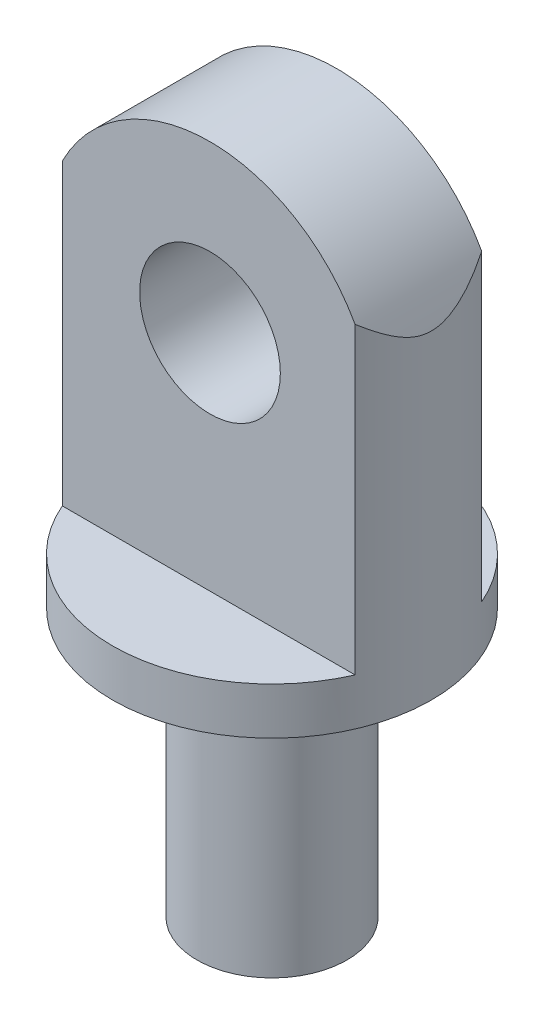
ISO-10303-21;
HEADER;
FILE_DESCRIPTION(('STEP AP214'),'2;1');
FILE_NAME('part.step','',(''),(''),'','','');
FILE_SCHEMA(('AUTOMOTIVE_DESIGN { 1 0 10303 214 1 1 1 1 }'));
ENDSEC;
DATA;
#1=APPLICATION_CONTEXT('core data for automotive mechanical design processes');
#2=APPLICATION_PROTOCOL_DEFINITION('international standard','automotive_design',2000,#1);
#3=PRODUCT_CONTEXT('',#1,'mechanical');
#4=PRODUCT('Part','Part','',(#3));
#5=PRODUCT_RELATED_PRODUCT_CATEGORY('part','',(#4));
#6=PRODUCT_DEFINITION_FORMATION('','',#4);
#7=PRODUCT_DEFINITION_CONTEXT('part definition',#1,'design');
#8=PRODUCT_DEFINITION('design','',#6,#7);
#9=PRODUCT_DEFINITION_SHAPE('','',#8);
#10=(LENGTH_UNIT() NAMED_UNIT(*) SI_UNIT(.MILLI.,.METRE.));
#11=(NAMED_UNIT(*) PLANE_ANGLE_UNIT() SI_UNIT($,.RADIAN.));
#12=(NAMED_UNIT(*) SI_UNIT($,.STERADIAN.) SOLID_ANGLE_UNIT());
#13=UNCERTAINTY_MEASURE_WITH_UNIT(LENGTH_MEASURE(1.E-05),#10,'distance_accuracy_value','');
#14=(GEOMETRIC_REPRESENTATION_CONTEXT(3) GLOBAL_UNCERTAINTY_ASSIGNED_CONTEXT((#13)) GLOBAL_UNIT_ASSIGNED_CONTEXT((#10,
#11,#12)) REPRESENTATION_CONTEXT('',''));
#15=CARTESIAN_POINT('',(0.,0.,0.));
#16=DIRECTION('',(0.,0.,1.));
#17=DIRECTION('',(1.,0.,0.));
#18=AXIS2_PLACEMENT_3D('',#15,#16,#17);
#19=CARTESIAN_POINT('',(-3.12049675532599,9.3,-1.35));
#20=DIRECTION('',(0.,0.,1.));
#21=DIRECTION('',(1.,0.,0.));
#22=AXIS2_PLACEMENT_3D('',#19,#20,#21);
#23=PLANE('',#22);
#24=CARTESIAN_POINT('',(0.0279390337068128,5.77003722118369,-1.35));
#25=DIRECTION('',(0.,0.,1.));
#26=DIRECTION('',(1.,0.,0.));
#27=AXIS2_PLACEMENT_3D('',#24,#25,#26);
#28=CIRCLE('',#27,1.5);
#29=CARTESIAN_POINT('',(1.52793903370681,5.77003722118369,-1.35));
#30=VERTEX_POINT('',#29);
#31=EDGE_CURVE('E104',#30,#30,#28,.T.);
#32=ORIENTED_EDGE('',*,*,#31,.T.);
#33=EDGE_LOOP('',(#32));
#34=FACE_BOUND('',#33,.T.);
#35=DIRECTION('',(0.,-1.,0.));
#36=VECTOR('',#35,1.);
#37=CARTESIAN_POINT('',(-3.12049675532599,9.3,-1.35));
#38=LINE('',#37,#36);
#39=CARTESIAN_POINT('',(-3.12049675532598,7.36627946538286,-1.35));
#40=VERTEX_POINT('',#39);
#41=CARTESIAN_POINT('',(-3.12049675532599,1.,-1.35));
#42=VERTEX_POINT('',#41);
#43=EDGE_CURVE('E112',#40,#42,#38,.T.);
#44=ORIENTED_EDGE('',*,*,#43,.F.);
#45=CARTESIAN_POINT('',(0.0279390337068128,5.77003722118369,-1.35));
#46=DIRECTION('',(0.,0.,1.));
#47=DIRECTION('',(1.,0.,0.));
#48=AXIS2_PLACEMENT_3D('',#45,#46,#47);
#49=CIRCLE('',#48,3.52996277881631);
#50=CARTESIAN_POINT('',(3.12049675532598,7.4720137070031,-1.35));
#51=VERTEX_POINT('',#50);
#52=EDGE_CURVE('E99',#40,#51,#49,.F.);
#53=ORIENTED_EDGE('',*,*,#52,.T.);
#54=DIRECTION('',(0.,-1.,0.));
#55=VECTOR('',#54,1.);
#56=CARTESIAN_POINT('',(3.12049675532599,9.3,-1.35));
#57=LINE('',#56,#55);
#58=CARTESIAN_POINT('',(3.12049675532599,1.,-1.35));
#59=VERTEX_POINT('',#58);
#60=EDGE_CURVE('E95',#51,#59,#57,.T.);
#61=ORIENTED_EDGE('',*,*,#60,.T.);
#62=DIRECTION('',(-1.,0.,0.));
#63=VECTOR('',#62,1.);
#64=CARTESIAN_POINT('',(-3.12049675532599,1.,-1.35));
#65=LINE('',#64,#63);
#66=EDGE_CURVE('E114',#59,#42,#65,.T.);
#67=ORIENTED_EDGE('',*,*,#66,.T.);
#68=EDGE_LOOP('',(#44,#53,#61,#67));
#69=FACE_BOUND('',#68,.T.);
#70=ADVANCED_FACE('F43',(#34,#69),#23,.F.);
#71=CARTESIAN_POINT('',(-3.12049675532599,9.3,1.35));
#72=DIRECTION('',(0.,0.,-1.));
#73=DIRECTION('',(-1.,0.,0.));
#74=AXIS2_PLACEMENT_3D('',#71,#72,#73);
#75=PLANE('',#74);
#76=CARTESIAN_POINT('',(0.0279390337068128,5.77003722118369,1.35));
#77=DIRECTION('',(0.,0.,1.));
#78=DIRECTION('',(1.,0.,0.));
#79=AXIS2_PLACEMENT_3D('',#76,#77,#78);
#80=CIRCLE('',#79,1.5);
#81=CARTESIAN_POINT('',(1.52793903370681,5.77003722118369,1.35));
#82=VERTEX_POINT('',#81);
#83=EDGE_CURVE('E170',#82,#82,#80,.T.);
#84=ORIENTED_EDGE('',*,*,#83,.F.);
#85=EDGE_LOOP('',(#84));
#86=FACE_BOUND('',#85,.T.);
#87=DIRECTION('',(0.,-1.,0.));
#88=VECTOR('',#87,1.);
#89=CARTESIAN_POINT('',(3.12049675532599,9.3,1.35));
#90=LINE('',#89,#88);
#91=CARTESIAN_POINT('',(3.12049675532598,7.4720137070031,1.35));
#92=VERTEX_POINT('',#91);
#93=CARTESIAN_POINT('',(3.12049675532599,1.,1.35));
#94=VERTEX_POINT('',#93);
#95=EDGE_CURVE('E92',#92,#94,#90,.T.);
#96=ORIENTED_EDGE('',*,*,#95,.F.);
#97=CARTESIAN_POINT('',(0.0279390337068128,5.77003722118369,1.35));
#98=DIRECTION('',(0.,0.,-1.));
#99=DIRECTION('',(-1.,0.,0.));
#100=AXIS2_PLACEMENT_3D('',#97,#98,#99);
#101=CIRCLE('',#100,3.52996277881631);
#102=CARTESIAN_POINT('',(-3.12049675532598,7.36627946538286,1.35));
#103=VERTEX_POINT('',#102);
#104=EDGE_CURVE('E62',#103,#92,#101,.T.);
#105=ORIENTED_EDGE('',*,*,#104,.F.);
#106=DIRECTION('',(0.,-1.,0.));
#107=VECTOR('',#106,1.);
#108=CARTESIAN_POINT('',(-3.12049675532599,9.3,1.35));
#109=LINE('',#108,#107);
#110=CARTESIAN_POINT('',(-3.12049675532599,1.,1.35));
#111=VERTEX_POINT('',#110);
#112=EDGE_CURVE('E67',#103,#111,#109,.T.);
#113=ORIENTED_EDGE('',*,*,#112,.T.);
#114=DIRECTION('',(1.,0.,0.));
#115=VECTOR('',#114,1.);
#116=CARTESIAN_POINT('',(-3.12049675532599,1.,1.35));
#117=LINE('',#116,#115);
#118=EDGE_CURVE('E107',#111,#94,#117,.T.);
#119=ORIENTED_EDGE('',*,*,#118,.T.);
#120=EDGE_LOOP('',(#96,#105,#113,#119));
#121=FACE_BOUND('',#120,.T.);
#122=ADVANCED_FACE('F106',(#86,#121),#75,.F.);
#123=CARTESIAN_POINT('',(0.,1.,0.));
#124=DIRECTION('',(0.,1.,0.));
#125=DIRECTION('',(0.,0.,1.));
#126=AXIS2_PLACEMENT_3D('',#123,#124,#125);
#127=PLANE('',#126);
#128=ORIENTED_EDGE('',*,*,#118,.F.);
#129=CARTESIAN_POINT('',(0.,1.,0.));
#130=DIRECTION('',(0.,1.,0.));
#131=DIRECTION('',(0.,0.,1.));
#132=AXIS2_PLACEMENT_3D('',#129,#130,#131);
#133=CIRCLE('',#132,3.4);
#134=EDGE_CURVE('E121',#111,#94,#133,.T.);
#135=ORIENTED_EDGE('',*,*,#134,.T.);
#136=EDGE_LOOP('',(#128,#135));
#137=FACE_BOUND('',#136,.T.);
#138=ADVANCED_FACE('F142',(#137),#127,.T.);
#139=CARTESIAN_POINT('',(0.,1.,0.));
#140=DIRECTION('',(0.,-1.,0.));
#141=DIRECTION('',(0.,0.,-1.));
#142=AXIS2_PLACEMENT_3D('',#139,#140,#141);
#143=CYLINDRICAL_SURFACE('',#142,3.4);
#144=ORIENTED_EDGE('',*,*,#112,.F.);
#145=CARTESIAN_POINT('',(-3.12049675532599,7.36627946538285,1.35));
#146=CARTESIAN_POINT('',(-3.13835972204669,7.33104740126524,1.30870279672957));
#147=CARTESIAN_POINT('',(-3.15543171618552,7.29590432031871,1.26700115462139));
#148=CARTESIAN_POINT('',(-3.18801107878575,7.22598859156736,1.18263831076883));
#149=CARTESIAN_POINT('',(-3.20351744842426,7.19121619274,1.13997651743272));
#150=CARTESIAN_POINT('',(-3.24834558717292,7.08625664404688,1.00845593041728));
#151=CARTESIAN_POINT('',(-3.2751692418621,7.01703714273189,0.917913322805052));
#152=CARTESIAN_POINT('',(-3.318376018674,6.89534314366831,0.745028519951713));
#153=CARTESIAN_POINT('',(-3.33573269520876,6.84193552851338,0.663587843724151));
#154=CARTESIAN_POINT('',(-3.36497472935822,6.74535711608895,0.494220762117089));
#155=CARTESIAN_POINT('',(-3.37690441674899,6.70210482768845,0.406353970461693));
#156=CARTESIAN_POINT('',(-3.38994096006507,6.65268673394296,0.265786519790559));
#157=CARTESIAN_POINT('',(-3.39349705340811,6.63866342545616,0.216204221311429));
#158=CARTESIAN_POINT('',(-3.39841397179403,6.61906447422805,0.115374924787544));
#159=CARTESIAN_POINT('',(-3.39978286441005,6.61345779109477,0.0641347590715606));
#160=CARTESIAN_POINT('',(-3.40016976104681,6.6118864843905,-0.0387512193840973));
#161=CARTESIAN_POINT('',(-3.3991768542728,6.61596661076721,-0.0903978119312477));
#162=CARTESIAN_POINT('',(-3.39494795471032,6.63291133929847,-0.192211801161633));
#163=CARTESIAN_POINT('',(-3.39170425385002,6.64580612588537,-0.242373495287974));
#164=CARTESIAN_POINT('',(-3.3806983981399,6.68792805368277,-0.370399121434243));
#165=CARTESIAN_POINT('',(-3.37138462176851,6.7223221191192,-0.446351756865674));
#166=CARTESIAN_POINT('',(-3.34870828685286,6.79986391848825,-0.593047876510019));
#167=CARTESIAN_POINT('',(-3.33532657700627,6.84305273235843,-0.663764709202611));
#168=CARTESIAN_POINT('',(-3.30799618374047,6.92487773811807,-0.787603772082848));
#169=CARTESIAN_POINT('',(-3.2946953100944,6.96269873559113,-0.841417789796555));
#170=CARTESIAN_POINT('',(-3.26587382675386,7.04013336704067,-0.947138222985811));
#171=CARTESIAN_POINT('',(-3.25035242823495,7.07974763462943,-0.999043952284647));
#172=CARTESIAN_POINT('',(-3.20047938650029,7.20024398063185,-1.15263017263718));
#173=CARTESIAN_POINT('',(-3.16285084648253,7.28268035154911,-1.25203844425146));
#174=CARTESIAN_POINT('',(-3.07877018787097,7.44864058509016,-1.44651056974721));
#175=CARTESIAN_POINT('',(-3.0322969393966,7.53216659643949,-1.54156332953332));
#176=CARTESIAN_POINT('',(-2.93040049675574,7.69834112583199,-1.72741805541759));
#177=CARTESIAN_POINT('',(-2.87498414097798,7.780990263323,-1.81822320158051));
#178=CARTESIAN_POINT('',(-2.75213870542953,7.94788726662824,-1.99956567835145));
#179=CARTESIAN_POINT('',(-2.68427755192303,8.03203658270921,-2.08990256394115));
#180=CARTESIAN_POINT('',(-2.53799239115065,8.19671597553888,-2.26531231563352));
#181=CARTESIAN_POINT('',(-2.45956376922629,8.27724445051383,-2.35038285818144));
#182=CARTESIAN_POINT('',(-2.29215231970408,8.43289648658402,-2.51389452877237));
#183=CARTESIAN_POINT('',(-2.20321664751848,8.50804193495514,-2.59236275946415));
#184=CARTESIAN_POINT('',(-2.01431582356768,8.65168652289616,-2.74171821686747));
#185=CARTESIAN_POINT('',(-1.91435525116252,8.72018839992025,-2.81260856725228));
#186=CARTESIAN_POINT('',(-1.68519426527011,8.85982401065345,-2.95659447626626));
#187=CARTESIAN_POINT('',(-1.55392244802971,8.92938136622014,-3.02796946368868));
#188=CARTESIAN_POINT('',(-1.27706502740677,9.05340650564181,-3.15470875996251));
#189=CARTESIAN_POINT('',(-1.13148688236315,9.10788209614216,-3.21008135265038));
#190=CARTESIAN_POINT('',(-0.903866793627061,9.17573258764701,-3.2786307790683));
#191=CARTESIAN_POINT('',(-0.826024770943882,9.19610762181012,-3.29912996606194));
#192=CARTESIAN_POINT('',(-0.667972970497185,9.23166845969418,-3.3347204061914));
#193=CARTESIAN_POINT('',(-0.58776448021972,9.24685703056795,-3.3498145433132));
#194=CARTESIAN_POINT('',(-0.425665541890074,9.27169354308473,-3.37424372612682));
#195=CARTESIAN_POINT('',(-0.343775998943727,9.28134438927959,-3.3835817910855));
#196=CARTESIAN_POINT('',(-0.179091776520774,9.29489393156395,-3.39628614904351));
#197=CARTESIAN_POINT('',(-0.0962972275508152,9.29879344628323,-3.39965329194238));
#198=CARTESIAN_POINT('',(0.130294939817914,9.30142978219462,-3.40052880638122));
#199=CARTESIAN_POINT('',(0.274273811478792,9.29427828880309,-3.39192474512508));
#200=CARTESIAN_POINT('',(0.558031911651326,9.26289733457396,-3.35694680443378));
#201=CARTESIAN_POINT('',(0.697810832626631,9.23866662629332,-3.33057162702624));
#202=CARTESIAN_POINT('',(0.966802496763593,9.17560070887764,-3.26253619316939));
#203=CARTESIAN_POINT('',(1.09617512841929,9.13708168930222,-3.22120730540052));
#204=CARTESIAN_POINT('',(1.3453089804967,9.04764719969381,-3.12537881383909));
#205=CARTESIAN_POINT('',(1.46506724373814,8.99672793487917,-3.07087517828587));
#206=CARTESIAN_POINT('',(1.74669894018757,8.85891200885263,-2.92313104152961));
#207=CARTESIAN_POINT('',(1.90247552432764,8.76626097070946,-2.82362628959726));
#208=CARTESIAN_POINT('',(2.19029182647743,8.56571078175546,-2.60677482120336));
#209=CARTESIAN_POINT('',(2.3222615082682,8.45776825675084,-2.4893772775001));
#210=CARTESIAN_POINT('',(2.52360999100693,8.26896152100358,-2.28144103741853));
#211=CARTESIAN_POINT('',(2.5993858692062,8.19070879763129,-2.19458539390921));
#212=CARTESIAN_POINT('',(2.74070048448525,8.03121268016173,-2.01534070362916));
#213=CARTESIAN_POINT('',(2.8062335120068,7.94996764905073,-1.92294861014805));
#214=CARTESIAN_POINT('',(2.92726262733571,7.78620044386805,-1.73314521045538));
#215=CARTESIAN_POINT('',(2.98277041915694,7.70367988276964,-1.63573992995314));
#216=CARTESIAN_POINT('',(3.08407362660139,7.53920929087276,-1.43564466061026));
#217=CARTESIAN_POINT('',(3.12987587829926,7.45725889809052,-1.33295845515361));
#218=CARTESIAN_POINT('',(3.20356858834906,7.31314598200695,-1.14252308278397));
#219=CARTESIAN_POINT('',(3.23320835446017,7.2503292957952,-1.05594481385374));
#220=CARTESIAN_POINT('',(3.28617874586199,7.12974512337499,-0.877340429571284));
#221=CARTESIAN_POINT('',(3.30950992749674,7.07197719222912,-0.785314795486593));
#222=CARTESIAN_POINT('',(3.34362976409976,6.98184385786677,-0.620560771977731));
#223=CARTESIAN_POINT('',(3.35610136283903,6.94689204438605,-0.549631370325113));
#224=CARTESIAN_POINT('',(3.37680920613197,6.88660469496284,-0.403214632972733));
#225=CARTESIAN_POINT('',(3.38505951440014,6.86123730229741,-0.327743380834235));
#226=CARTESIAN_POINT('',(3.39504406093921,6.82996598945132,-0.192437194916563));
#227=CARTESIAN_POINT('',(3.39789916604179,6.82076043385016,-0.133480921970949));
#228=CARTESIAN_POINT('',(3.40048323451124,6.81244185453349,-0.0148321686208128));
#229=CARTESIAN_POINT('',(3.40021694188235,6.81331351510153,0.044859056869009));
#230=CARTESIAN_POINT('',(3.39660842382303,6.82489783192266,0.162902604187038));
#231=CARTESIAN_POINT('',(3.39327734176061,6.83557483634651,0.221258992102135));
#232=CARTESIAN_POINT('',(3.38386854733478,6.86484859485868,0.335781088161258));
#233=CARTESIAN_POINT('',(3.37778346407094,6.88346659474108,0.391940475074137));
#234=CARTESIAN_POINT('',(3.35576371278402,6.94827827669542,0.558131472557084));
#235=CARTESIAN_POINT('',(3.33613504766724,7.00314151014079,0.664177865706165));
#236=CARTESIAN_POINT('',(3.28891454055171,7.12315316834822,0.868374972413376));
#237=CARTESIAN_POINT('',(3.26128785291351,7.18834602192244,0.966488679160412));
#238=CARTESIAN_POINT('',(3.2136447776228,7.29103574895804,1.11139356674356));
#239=CARTESIAN_POINT('',(3.19631303707653,7.32685714355403,1.16027664235523));
#240=CARTESIAN_POINT('',(3.15980007043323,7.39905900082954,1.25629661860335));
#241=CARTESIAN_POINT('',(3.14063385673121,7.435433168922,1.30344394539902));
#242=CARTESIAN_POINT('',(3.12049675532598,7.4720137070031,1.35));
#243=B_SPLINE_CURVE_WITH_KNOTS('',3,(#145,#146,#147,#148,#149,#150,#151,#152,#153,#154,#155,
#156,#157,#158,#159,#160,#161,#162,#163,#164,#165,#166,#167,#168,#169,#170,#171,#172,#173,#174,
#175,#176,#177,#178,#179,#180,#181,#182,#183,#184,#185,#186,#187,#188,#189,#190,#191,#192,#193,
#194,#195,#196,#197,#198,#199,#200,#201,#202,#203,#204,#205,#206,#207,#208,#209,#210,#211,#212,
#213,#214,#215,#216,#217,#218,#219,#220,#221,#222,#223,#224,#225,#226,#227,#228,#229,#230,#231,
#232,#233,#234,#235,#236,#237,#238,#239,#240,#241,#242),.UNSPECIFIED.,.F.,.F.,(4,2,2,2,2,2,2,2,
2,2,2,2,2,2,2,2,2,2,2,2,2,2,2,2,2,2,2,2,2,2,2,2,2,2,2,2,2,2,2,2,2,2,2,2,2,2,2,2,4),(0.,
0.171414402195746,0.342937479827734,0.693719363875708,0.990177812989339,1.28416916300459,
1.43853088070619,1.59232190390474,1.74682477365027,1.90185938237823,2.15212964549633,
2.40359689119323,2.60480694928063,2.80608866401376,3.2091769292447,3.61324053691841,
4.01699662681526,4.43913639564744,4.86146110780848,5.28195770845541,5.70228030257592,
6.19494852146544,6.68736124587593,6.93615159371887,7.18480899537419,7.4333358560417,
7.68182733861831,8.11266615952163,8.54353645157818,8.96539131169241,9.38737543241257,
10.0042692626047,10.6229493115016,11.0404075113578,11.4580975867314,11.8752968303578,
12.2922012366645,12.6249196693804,12.9576087506084,13.1972749994276,13.4361374865315,
13.6145274333072,13.7926462922977,13.9701200715682,14.1480716825484,14.5090081609116,
14.8715414552817,15.0605889543846,15.2482036994267),.UNSPECIFIED.);
#244=EDGE_CURVE('E101',#103,#40,#243,.T.);
#245=ORIENTED_EDGE('',*,*,#244,.T.);
#246=ORIENTED_EDGE('',*,*,#43,.T.);
#247=EDGE_CURVE('E54',#59,#42,#133,.T.);
#248=ORIENTED_EDGE('',*,*,#247,.F.);
#249=ORIENTED_EDGE('',*,*,#60,.F.);
#250=EDGE_CURVE('E89',#51,#92,#243,.T.);
#251=ORIENTED_EDGE('',*,*,#250,.T.);
#252=ORIENTED_EDGE('',*,*,#95,.T.);
#253=ORIENTED_EDGE('',*,*,#134,.F.);
#254=EDGE_LOOP('',(#144,#245,#246,#248,#249,#251,#252,#253));
#255=FACE_BOUND('',#254,.T.);
#256=CARTESIAN_POINT('',(0.,0.,0.));
#257=DIRECTION('',(0.,1.,0.));
#258=DIRECTION('',(0.,0.,1.));
#259=AXIS2_PLACEMENT_3D('',#256,#257,#258);
#260=CIRCLE('',#259,3.4);
#261=CARTESIAN_POINT('',(0.,0.,3.4));
#262=VERTEX_POINT('',#261);
#263=EDGE_CURVE('E48',#262,#262,#260,.T.);
#264=ORIENTED_EDGE('',*,*,#263,.T.);
#265=EDGE_LOOP('',(#264));
#266=FACE_BOUND('',#265,.T.);
#267=ADVANCED_FACE('F45',(#255,#266),#143,.T.);
#268=ORIENTED_EDGE('',*,*,#66,.F.);
#269=ORIENTED_EDGE('',*,*,#247,.T.);
#270=EDGE_LOOP('',(#268,#269));
#271=FACE_BOUND('',#270,.T.);
#272=ADVANCED_FACE('F132',(#271),#127,.T.);
#273=CARTESIAN_POINT('',(0.,0.,0.));
#274=DIRECTION('',(0.,1.,0.));
#275=DIRECTION('',(0.,0.,1.));
#276=AXIS2_PLACEMENT_3D('',#273,#274,#275);
#277=PLANE('',#276);
#278=CARTESIAN_POINT('',(0.,0.,0.));
#279=DIRECTION('',(0.,-1.,0.));
#280=DIRECTION('',(0.,0.,-1.));
#281=AXIS2_PLACEMENT_3D('',#278,#279,#280);
#282=CIRCLE('',#281,1.6);
#283=CARTESIAN_POINT('',(0.,0.,-1.6));
#284=VERTEX_POINT('',#283);
#285=EDGE_CURVE('E11',#284,#284,#282,.T.);
#286=ORIENTED_EDGE('',*,*,#285,.F.);
#287=EDGE_LOOP('',(#286));
#288=FACE_BOUND('',#287,.T.);
#289=ORIENTED_EDGE('',*,*,#263,.F.);
#290=EDGE_LOOP('',(#289));
#291=FACE_BOUND('',#290,.T.);
#292=ADVANCED_FACE('F130',(#288,#291),#277,.F.);
#293=CARTESIAN_POINT('',(0.0279390337068128,5.77003722118369,-3.4));
#294=DIRECTION('',(0.,0.,1.));
#295=DIRECTION('',(1.,0.,0.));
#296=AXIS2_PLACEMENT_3D('',#293,#294,#295);
#297=CYLINDRICAL_SURFACE('',#296,3.52996277881631);
#298=ORIENTED_EDGE('',*,*,#244,.F.);
#299=ORIENTED_EDGE('',*,*,#104,.T.);
#300=ORIENTED_EDGE('',*,*,#250,.F.);
#301=ORIENTED_EDGE('',*,*,#52,.F.);
#302=EDGE_LOOP('',(#298,#299,#300,#301));
#303=FACE_BOUND('',#302,.T.);
#304=ADVANCED_FACE('F102',(#303),#297,.T.);
#305=CARTESIAN_POINT('',(0.0279390337068128,5.77003722118369,-3.4));
#306=DIRECTION('',(0.,0.,1.));
#307=DIRECTION('',(1.,0.,0.));
#308=AXIS2_PLACEMENT_3D('',#305,#306,#307);
#309=CYLINDRICAL_SURFACE('',#308,1.5);
#310=ORIENTED_EDGE('',*,*,#83,.T.);
#311=EDGE_LOOP('',(#310));
#312=FACE_BOUND('',#311,.T.);
#313=ORIENTED_EDGE('',*,*,#31,.F.);
#314=EDGE_LOOP('',(#313));
#315=FACE_BOUND('',#314,.T.);
#316=ADVANCED_FACE('F138',(#312,#315),#309,.F.);
#317=CARTESIAN_POINT('',(0.,-5.7,0.));
#318=DIRECTION('',(0.,1.,0.));
#319=DIRECTION('',(0.,0.,1.));
#320=AXIS2_PLACEMENT_3D('',#317,#318,#319);
#321=CYLINDRICAL_SURFACE('',#320,1.6);
#322=CARTESIAN_POINT('',(0.,-5.7,0.));
#323=DIRECTION('',(0.,-1.,0.));
#324=DIRECTION('',(0.,0.,-1.));
#325=AXIS2_PLACEMENT_3D('',#322,#323,#324);
#326=CIRCLE('',#325,1.6);
#327=CARTESIAN_POINT('',(0.,-5.7,-1.6));
#328=VERTEX_POINT('',#327);
#329=EDGE_CURVE('E174',#328,#328,#326,.T.);
#330=ORIENTED_EDGE('',*,*,#329,.F.);
#331=EDGE_LOOP('',(#330));
#332=FACE_BOUND('',#331,.T.);
#333=ORIENTED_EDGE('',*,*,#285,.T.);
#334=EDGE_LOOP('',(#333));
#335=FACE_BOUND('',#334,.T.);
#336=ADVANCED_FACE('F182',(#332,#335),#321,.T.);
#337=CARTESIAN_POINT('',(0.,-5.7,0.));
#338=DIRECTION('',(0.,-1.,0.));
#339=DIRECTION('',(0.,0.,-1.));
#340=AXIS2_PLACEMENT_3D('',#337,#338,#339);
#341=PLANE('',#340);
#342=ORIENTED_EDGE('',*,*,#329,.T.);
#343=EDGE_LOOP('',(#342));
#344=FACE_BOUND('',#343,.T.);
#345=ADVANCED_FACE('F180',(#344),#341,.T.);
#346=CLOSED_SHELL('',(#70,#122,#138,#267,#272,#292,#304,#316,#336,#345));
#347=MANIFOLD_SOLID_BREP('B2',#346);
#348=ADVANCED_BREP_SHAPE_REPRESENTATION('',(#18,#347),#14);
#349=SHAPE_DEFINITION_REPRESENTATION(#9,#348);
ENDSEC;
END-ISO-10303-21;
